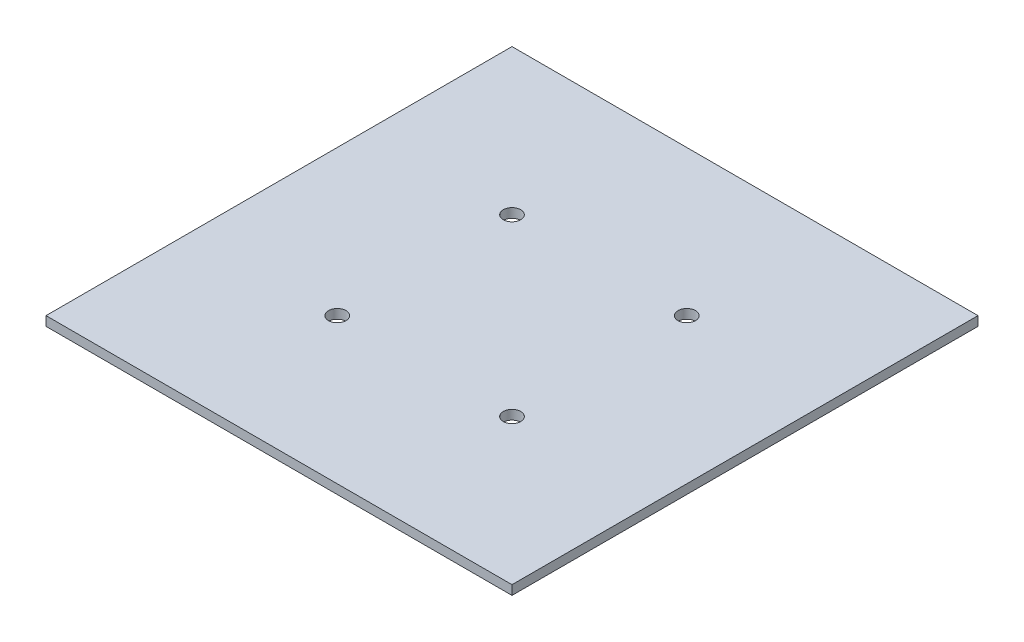
ISO-10303-21;
HEADER;
FILE_DESCRIPTION(('STEP AP214'),'2;1');
FILE_NAME('part.step','',(''),(''),'','','');
FILE_SCHEMA(('AUTOMOTIVE_DESIGN { 1 0 10303 214 1 1 1 1 }'));
ENDSEC;
DATA;
#1=APPLICATION_CONTEXT('core data for automotive mechanical design processes');
#2=APPLICATION_PROTOCOL_DEFINITION('international standard','automotive_design',2000,#1);
#3=PRODUCT_CONTEXT('',#1,'mechanical');
#4=PRODUCT('Part','Part','',(#3));
#5=PRODUCT_RELATED_PRODUCT_CATEGORY('part','',(#4));
#6=PRODUCT_DEFINITION_FORMATION('','',#4);
#7=PRODUCT_DEFINITION_CONTEXT('part definition',#1,'design');
#8=PRODUCT_DEFINITION('design','',#6,#7);
#9=PRODUCT_DEFINITION_SHAPE('','',#8);
#10=(LENGTH_UNIT() NAMED_UNIT(*) SI_UNIT(.MILLI.,.METRE.));
#11=(NAMED_UNIT(*) PLANE_ANGLE_UNIT() SI_UNIT($,.RADIAN.));
#12=(NAMED_UNIT(*) SI_UNIT($,.STERADIAN.) SOLID_ANGLE_UNIT());
#13=UNCERTAINTY_MEASURE_WITH_UNIT(LENGTH_MEASURE(1.E-05),#10,'distance_accuracy_value','');
#14=(GEOMETRIC_REPRESENTATION_CONTEXT(3) GLOBAL_UNCERTAINTY_ASSIGNED_CONTEXT((#13)) GLOBAL_UNIT_ASSIGNED_CONTEXT((#10,
#11,#12)) REPRESENTATION_CONTEXT('',''));
#15=CARTESIAN_POINT('',(0.,0.,0.));
#16=DIRECTION('',(0.,0.,1.));
#17=DIRECTION('',(1.,0.,0.));
#18=AXIS2_PLACEMENT_3D('',#15,#16,#17);
#19=CARTESIAN_POINT('',(-40.,1.6,40.));
#20=DIRECTION('',(0.,1.,0.));
#21=DIRECTION('',(0.,0.,1.));
#22=AXIS2_PLACEMENT_3D('',#19,#20,#21);
#23=PLANE('',#22);
#24=CARTESIAN_POINT('',(15.,1.6,15.));
#25=DIRECTION('',(0.,1.,0.));
#26=DIRECTION('',(0.,0.,-1.));
#27=AXIS2_PLACEMENT_3D('',#24,#25,#26);
#28=CIRCLE('',#27,1.5);
#29=CARTESIAN_POINT('',(15.,1.6,13.5));
#30=VERTEX_POINT('',#29);
#31=EDGE_CURVE('E120',#30,#30,#28,.T.);
#32=ORIENTED_EDGE('',*,*,#31,.F.);
#33=EDGE_LOOP('',(#32));
#34=FACE_BOUND('',#33,.T.);
#35=CARTESIAN_POINT('',(15.,1.6,-15.));
#36=DIRECTION('',(0.,1.,0.));
#37=DIRECTION('',(0.,0.,1.));
#38=AXIS2_PLACEMENT_3D('',#35,#36,#37);
#39=CIRCLE('',#38,1.5);
#40=CARTESIAN_POINT('',(15.,1.6,-13.5));
#41=VERTEX_POINT('',#40);
#42=EDGE_CURVE('E99',#41,#41,#39,.T.);
#43=ORIENTED_EDGE('',*,*,#42,.F.);
#44=EDGE_LOOP('',(#43));
#45=FACE_BOUND('',#44,.T.);
#46=DIRECTION('',(0.,0.,1.));
#47=VECTOR('',#46,1.);
#48=CARTESIAN_POINT('',(-40.,1.6,-40.));
#49=LINE('',#48,#47);
#50=CARTESIAN_POINT('',(-40.,1.6,-40.));
#51=VERTEX_POINT('',#50);
#52=CARTESIAN_POINT('',(-40.,1.6,40.));
#53=VERTEX_POINT('',#52);
#54=EDGE_CURVE('E84',#51,#53,#49,.T.);
#55=ORIENTED_EDGE('',*,*,#54,.T.);
#56=DIRECTION('',(1.,0.,0.));
#57=VECTOR('',#56,1.);
#58=CARTESIAN_POINT('',(-40.,1.6,40.));
#59=LINE('',#58,#57);
#60=CARTESIAN_POINT('',(40.,1.6,40.));
#61=VERTEX_POINT('',#60);
#62=EDGE_CURVE('E79',#53,#61,#59,.T.);
#63=ORIENTED_EDGE('',*,*,#62,.T.);
#64=DIRECTION('',(0.,0.,-1.));
#65=VECTOR('',#64,1.);
#66=CARTESIAN_POINT('',(40.,1.6,-40.));
#67=LINE('',#66,#65);
#68=CARTESIAN_POINT('',(40.,1.6,-40.));
#69=VERTEX_POINT('',#68);
#70=EDGE_CURVE('E82',#61,#69,#67,.T.);
#71=ORIENTED_EDGE('',*,*,#70,.T.);
#72=DIRECTION('',(-1.,0.,0.));
#73=VECTOR('',#72,1.);
#74=CARTESIAN_POINT('',(-40.,1.6,-40.));
#75=LINE('',#74,#73);
#76=EDGE_CURVE('E49',#69,#51,#75,.T.);
#77=ORIENTED_EDGE('',*,*,#76,.T.);
#78=EDGE_LOOP('',(#55,#63,#71,#77));
#79=FACE_BOUND('',#78,.T.);
#80=CARTESIAN_POINT('',(-15.,1.6,-15.));
#81=DIRECTION('',(0.,1.,0.));
#82=DIRECTION('',(0.,0.,-1.));
#83=AXIS2_PLACEMENT_3D('',#80,#81,#82);
#84=CIRCLE('',#83,1.5);
#85=CARTESIAN_POINT('',(-15.,1.6,-16.5));
#86=VERTEX_POINT('',#85);
#87=EDGE_CURVE('E114',#86,#86,#84,.T.);
#88=ORIENTED_EDGE('',*,*,#87,.F.);
#89=EDGE_LOOP('',(#88));
#90=FACE_BOUND('',#89,.T.);
#91=CARTESIAN_POINT('',(-15.,1.6,15.));
#92=DIRECTION('',(0.,1.,0.));
#93=DIRECTION('',(0.,0.,1.));
#94=AXIS2_PLACEMENT_3D('',#91,#92,#93);
#95=CIRCLE('',#94,1.5);
#96=CARTESIAN_POINT('',(-15.,1.6,16.5));
#97=VERTEX_POINT('',#96);
#98=EDGE_CURVE('E126',#97,#97,#95,.T.);
#99=ORIENTED_EDGE('',*,*,#98,.F.);
#100=EDGE_LOOP('',(#99));
#101=FACE_BOUND('',#100,.T.);
#102=ADVANCED_FACE('F32',(#34,#45,#79,#90,#101),#23,.T.);
#103=CARTESIAN_POINT('',(-40.,0.,40.));
#104=DIRECTION('',(0.,1.,0.));
#105=DIRECTION('',(0.,0.,1.));
#106=AXIS2_PLACEMENT_3D('',#103,#104,#105);
#107=PLANE('',#106);
#108=CARTESIAN_POINT('',(15.,0.,15.));
#109=DIRECTION('',(0.,1.,0.));
#110=DIRECTION('',(0.,0.,-1.));
#111=AXIS2_PLACEMENT_3D('',#108,#109,#110);
#112=CIRCLE('',#111,1.5);
#113=CARTESIAN_POINT('',(15.,0.,13.5));
#114=VERTEX_POINT('',#113);
#115=EDGE_CURVE('E123',#114,#114,#112,.T.);
#116=ORIENTED_EDGE('',*,*,#115,.T.);
#117=EDGE_LOOP('',(#116));
#118=FACE_BOUND('',#117,.T.);
#119=CARTESIAN_POINT('',(15.,0.,-15.));
#120=DIRECTION('',(0.,1.,0.));
#121=DIRECTION('',(0.,0.,1.));
#122=AXIS2_PLACEMENT_3D('',#119,#120,#121);
#123=CIRCLE('',#122,1.5);
#124=CARTESIAN_POINT('',(15.,0.,-13.5));
#125=VERTEX_POINT('',#124);
#126=EDGE_CURVE('E111',#125,#125,#123,.T.);
#127=ORIENTED_EDGE('',*,*,#126,.T.);
#128=EDGE_LOOP('',(#127));
#129=FACE_BOUND('',#128,.T.);
#130=DIRECTION('',(0.,0.,1.));
#131=VECTOR('',#130,1.);
#132=CARTESIAN_POINT('',(-40.,0.,-40.));
#133=LINE('',#132,#131);
#134=CARTESIAN_POINT('',(-40.,0.,-40.));
#135=VERTEX_POINT('',#134);
#136=CARTESIAN_POINT('',(-40.,0.,40.));
#137=VERTEX_POINT('',#136);
#138=EDGE_CURVE('E96',#135,#137,#133,.T.);
#139=ORIENTED_EDGE('',*,*,#138,.F.);
#140=DIRECTION('',(-1.,0.,0.));
#141=VECTOR('',#140,1.);
#142=CARTESIAN_POINT('',(-40.,0.,-40.));
#143=LINE('',#142,#141);
#144=CARTESIAN_POINT('',(40.,0.,-40.));
#145=VERTEX_POINT('',#144);
#146=EDGE_CURVE('E72',#145,#135,#143,.T.);
#147=ORIENTED_EDGE('',*,*,#146,.F.);
#148=DIRECTION('',(0.,0.,-1.));
#149=VECTOR('',#148,1.);
#150=CARTESIAN_POINT('',(40.,0.,-40.));
#151=LINE('',#150,#149);
#152=CARTESIAN_POINT('',(40.,0.,40.));
#153=VERTEX_POINT('',#152);
#154=EDGE_CURVE('E66',#153,#145,#151,.T.);
#155=ORIENTED_EDGE('',*,*,#154,.F.);
#156=DIRECTION('',(1.,0.,0.));
#157=VECTOR('',#156,1.);
#158=CARTESIAN_POINT('',(-40.,0.,40.));
#159=LINE('',#158,#157);
#160=EDGE_CURVE('E88',#137,#153,#159,.T.);
#161=ORIENTED_EDGE('',*,*,#160,.F.);
#162=EDGE_LOOP('',(#139,#147,#155,#161));
#163=FACE_BOUND('',#162,.T.);
#164=CARTESIAN_POINT('',(-15.,0.,-15.));
#165=DIRECTION('',(0.,1.,0.));
#166=DIRECTION('',(0.,0.,-1.));
#167=AXIS2_PLACEMENT_3D('',#164,#165,#166);
#168=CIRCLE('',#167,1.5);
#169=CARTESIAN_POINT('',(-15.,0.,-16.5));
#170=VERTEX_POINT('',#169);
#171=EDGE_CURVE('E117',#170,#170,#168,.T.);
#172=ORIENTED_EDGE('',*,*,#171,.T.);
#173=EDGE_LOOP('',(#172));
#174=FACE_BOUND('',#173,.T.);
#175=CARTESIAN_POINT('',(-15.,0.,15.));
#176=DIRECTION('',(0.,1.,0.));
#177=DIRECTION('',(0.,0.,1.));
#178=AXIS2_PLACEMENT_3D('',#175,#176,#177);
#179=CIRCLE('',#178,1.5);
#180=CARTESIAN_POINT('',(-15.,0.,16.5));
#181=VERTEX_POINT('',#180);
#182=EDGE_CURVE('E129',#181,#181,#179,.T.);
#183=ORIENTED_EDGE('',*,*,#182,.T.);
#184=EDGE_LOOP('',(#183));
#185=FACE_BOUND('',#184,.T.);
#186=ADVANCED_FACE('F107',(#118,#129,#163,#174,#185),#107,.F.);
#187=CARTESIAN_POINT('',(-40.,1.6,-40.));
#188=DIRECTION('',(1.,0.,0.));
#189=DIRECTION('',(0.,0.,-1.));
#190=AXIS2_PLACEMENT_3D('',#187,#188,#189);
#191=PLANE('',#190);
#192=ORIENTED_EDGE('',*,*,#138,.T.);
#193=DIRECTION('',(0.,-1.,0.));
#194=VECTOR('',#193,1.);
#195=CARTESIAN_POINT('',(-40.,1.6,40.));
#196=LINE('',#195,#194);
#197=EDGE_CURVE('E11',#53,#137,#196,.T.);
#198=ORIENTED_EDGE('',*,*,#197,.F.);
#199=ORIENTED_EDGE('',*,*,#54,.F.);
#200=DIRECTION('',(0.,-1.,0.));
#201=VECTOR('',#200,1.);
#202=CARTESIAN_POINT('',(-40.,1.6,-40.));
#203=LINE('',#202,#201);
#204=EDGE_CURVE('E92',#51,#135,#203,.T.);
#205=ORIENTED_EDGE('',*,*,#204,.T.);
#206=EDGE_LOOP('',(#192,#198,#199,#205));
#207=FACE_BOUND('',#206,.T.);
#208=ADVANCED_FACE('F34',(#207),#191,.F.);
#209=CARTESIAN_POINT('',(-40.,1.6,40.));
#210=DIRECTION('',(0.,0.,-1.));
#211=DIRECTION('',(-1.,0.,0.));
#212=AXIS2_PLACEMENT_3D('',#209,#210,#211);
#213=PLANE('',#212);
#214=ORIENTED_EDGE('',*,*,#160,.T.);
#215=DIRECTION('',(0.,-1.,0.));
#216=VECTOR('',#215,1.);
#217=CARTESIAN_POINT('',(40.,1.6,40.));
#218=LINE('',#217,#216);
#219=EDGE_CURVE('E41',#61,#153,#218,.T.);
#220=ORIENTED_EDGE('',*,*,#219,.F.);
#221=ORIENTED_EDGE('',*,*,#62,.F.);
#222=ORIENTED_EDGE('',*,*,#197,.T.);
#223=EDGE_LOOP('',(#214,#220,#221,#222));
#224=FACE_BOUND('',#223,.T.);
#225=ADVANCED_FACE('F87',(#224),#213,.F.);
#226=CARTESIAN_POINT('',(40.,1.6,-40.));
#227=DIRECTION('',(-1.,0.,0.));
#228=DIRECTION('',(0.,0.,1.));
#229=AXIS2_PLACEMENT_3D('',#226,#227,#228);
#230=PLANE('',#229);
#231=ORIENTED_EDGE('',*,*,#154,.T.);
#232=DIRECTION('',(0.,-1.,0.));
#233=VECTOR('',#232,1.);
#234=CARTESIAN_POINT('',(40.,1.6,-40.));
#235=LINE('',#234,#233);
#236=EDGE_CURVE('E89',#69,#145,#235,.T.);
#237=ORIENTED_EDGE('',*,*,#236,.F.);
#238=ORIENTED_EDGE('',*,*,#70,.F.);
#239=ORIENTED_EDGE('',*,*,#219,.T.);
#240=EDGE_LOOP('',(#231,#237,#238,#239));
#241=FACE_BOUND('',#240,.T.);
#242=ADVANCED_FACE('F90',(#241),#230,.F.);
#243=CARTESIAN_POINT('',(-40.,1.6,-40.));
#244=DIRECTION('',(0.,0.,1.));
#245=DIRECTION('',(1.,0.,0.));
#246=AXIS2_PLACEMENT_3D('',#243,#244,#245);
#247=PLANE('',#246);
#248=ORIENTED_EDGE('',*,*,#146,.T.);
#249=ORIENTED_EDGE('',*,*,#204,.F.);
#250=ORIENTED_EDGE('',*,*,#76,.F.);
#251=ORIENTED_EDGE('',*,*,#236,.T.);
#252=EDGE_LOOP('',(#248,#249,#250,#251));
#253=FACE_BOUND('',#252,.T.);
#254=ADVANCED_FACE('F104',(#253),#247,.F.);
#255=CARTESIAN_POINT('',(15.,1.6,-15.));
#256=DIRECTION('',(0.,-1.,0.));
#257=DIRECTION('',(0.,0.,-1.));
#258=AXIS2_PLACEMENT_3D('',#255,#256,#257);
#259=CYLINDRICAL_SURFACE('',#258,1.5);
#260=ORIENTED_EDGE('',*,*,#42,.T.);
#261=EDGE_LOOP('',(#260));
#262=FACE_BOUND('',#261,.T.);
#263=ORIENTED_EDGE('',*,*,#126,.F.);
#264=EDGE_LOOP('',(#263));
#265=FACE_BOUND('',#264,.T.);
#266=ADVANCED_FACE('F149',(#262,#265),#259,.F.);
#267=CARTESIAN_POINT('',(-15.,1.6,-15.));
#268=DIRECTION('',(0.,-1.,0.));
#269=DIRECTION('',(0.,0.,-1.));
#270=AXIS2_PLACEMENT_3D('',#267,#268,#269);
#271=CYLINDRICAL_SURFACE('',#270,1.5);
#272=ORIENTED_EDGE('',*,*,#87,.T.);
#273=EDGE_LOOP('',(#272));
#274=FACE_BOUND('',#273,.T.);
#275=ORIENTED_EDGE('',*,*,#171,.F.);
#276=EDGE_LOOP('',(#275));
#277=FACE_BOUND('',#276,.T.);
#278=ADVANCED_FACE('F195',(#274,#277),#271,.F.);
#279=CARTESIAN_POINT('',(15.,1.6,15.));
#280=DIRECTION('',(0.,-1.,0.));
#281=DIRECTION('',(0.,0.,-1.));
#282=AXIS2_PLACEMENT_3D('',#279,#280,#281);
#283=CYLINDRICAL_SURFACE('',#282,1.5);
#284=ORIENTED_EDGE('',*,*,#31,.T.);
#285=EDGE_LOOP('',(#284));
#286=FACE_BOUND('',#285,.T.);
#287=ORIENTED_EDGE('',*,*,#115,.F.);
#288=EDGE_LOOP('',(#287));
#289=FACE_BOUND('',#288,.T.);
#290=ADVANCED_FACE('F203',(#286,#289),#283,.F.);
#291=CARTESIAN_POINT('',(-15.,1.6,15.));
#292=DIRECTION('',(0.,-1.,0.));
#293=DIRECTION('',(0.,0.,-1.));
#294=AXIS2_PLACEMENT_3D('',#291,#292,#293);
#295=CYLINDRICAL_SURFACE('',#294,1.5);
#296=ORIENTED_EDGE('',*,*,#98,.T.);
#297=EDGE_LOOP('',(#296));
#298=FACE_BOUND('',#297,.T.);
#299=ORIENTED_EDGE('',*,*,#182,.F.);
#300=EDGE_LOOP('',(#299));
#301=FACE_BOUND('',#300,.T.);
#302=ADVANCED_FACE('F135',(#298,#301),#295,.F.);
#303=CLOSED_SHELL('',(#102,#186,#208,#225,#242,#254,#266,#278,#290,#302));
#304=MANIFOLD_SOLID_BREP('B2',#303);
#305=ADVANCED_BREP_SHAPE_REPRESENTATION('',(#18,#304),#14);
#306=SHAPE_DEFINITION_REPRESENTATION(#9,#305);
ENDSEC;
END-ISO-10303-21;
